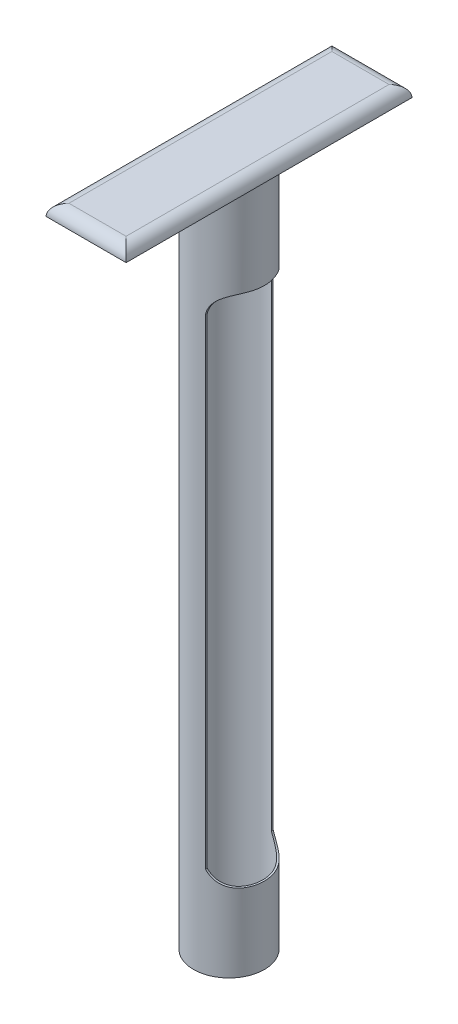
ISO-10303-21;
HEADER;
FILE_DESCRIPTION(('STEP AP214'),'2;1');
FILE_NAME('part.step','',(''),(''),'','','');
FILE_SCHEMA(('AUTOMOTIVE_DESIGN { 1 0 10303 214 1 1 1 1 }'));
ENDSEC;
DATA;
#1=APPLICATION_CONTEXT('core data for automotive mechanical design processes');
#2=APPLICATION_PROTOCOL_DEFINITION('international standard','automotive_design',2000,#1);
#3=PRODUCT_CONTEXT('',#1,'mechanical');
#4=PRODUCT('Part','Part','',(#3));
#5=PRODUCT_RELATED_PRODUCT_CATEGORY('part','',(#4));
#6=PRODUCT_DEFINITION_FORMATION('','',#4);
#7=PRODUCT_DEFINITION_CONTEXT('part definition',#1,'design');
#8=PRODUCT_DEFINITION('design','',#6,#7);
#9=PRODUCT_DEFINITION_SHAPE('','',#8);
#10=(LENGTH_UNIT() NAMED_UNIT(*) SI_UNIT(.MILLI.,.METRE.));
#11=(NAMED_UNIT(*) PLANE_ANGLE_UNIT() SI_UNIT($,.RADIAN.));
#12=(NAMED_UNIT(*) SI_UNIT($,.STERADIAN.) SOLID_ANGLE_UNIT());
#13=UNCERTAINTY_MEASURE_WITH_UNIT(LENGTH_MEASURE(1.E-05),#10,'distance_accuracy_value','');
#14=(GEOMETRIC_REPRESENTATION_CONTEXT(3) GLOBAL_UNCERTAINTY_ASSIGNED_CONTEXT((#13)) GLOBAL_UNIT_ASSIGNED_CONTEXT((#10,
#11,#12)) REPRESENTATION_CONTEXT('',''));
#15=CARTESIAN_POINT('',(0.,0.,0.));
#16=DIRECTION('',(0.,0.,1.));
#17=DIRECTION('',(1.,0.,0.));
#18=AXIS2_PLACEMENT_3D('',#15,#16,#17);
#19=CARTESIAN_POINT('',(0.,300.,0.));
#20=DIRECTION('',(0.,-1.,0.));
#21=DIRECTION('',(0.,0.,-1.));
#22=AXIS2_PLACEMENT_3D('',#19,#20,#21);
#23=CYLINDRICAL_SURFACE('',#22,15.5);
#24=CARTESIAN_POINT('',(0.,300.,0.));
#25=DIRECTION('',(0.,1.,0.));
#26=DIRECTION('',(0.,0.,1.));
#27=AXIS2_PLACEMENT_3D('',#24,#25,#26);
#28=CIRCLE('',#27,15.5);
#29=CARTESIAN_POINT('',(0.,300.,15.5));
#30=VERTEX_POINT('',#29);
#31=EDGE_CURVE('E186',#30,#30,#28,.T.);
#32=ORIENTED_EDGE('',*,*,#31,.F.);
#33=EDGE_LOOP('',(#32));
#34=FACE_BOUND('',#33,.T.);
#35=CARTESIAN_POINT('',(0.,0.,0.));
#36=DIRECTION('',(0.,1.,0.));
#37=DIRECTION('',(0.,0.,1.));
#38=AXIS2_PLACEMENT_3D('',#35,#36,#37);
#39=CIRCLE('',#38,15.5);
#40=CARTESIAN_POINT('',(0.,0.,15.5));
#41=VERTEX_POINT('',#40);
#42=EDGE_CURVE('E188',#41,#41,#39,.T.);
#43=ORIENTED_EDGE('',*,*,#42,.T.);
#44=EDGE_LOOP('',(#43));
#45=FACE_BOUND('',#44,.T.);
#46=DIRECTION('',(0.,-1.,0.));
#47=VECTOR('',#46,1.);
#48=CARTESIAN_POINT('',(4.5,300.,14.8323969741913));
#49=LINE('',#48,#47);
#50=CARTESIAN_POINT('',(4.5,250.,14.8323969741913));
#51=VERTEX_POINT('',#50);
#52=CARTESIAN_POINT('',(4.5,40.,14.8323969741913));
#53=VERTEX_POINT('',#52);
#54=EDGE_CURVE('E112',#51,#53,#49,.T.);
#55=ORIENTED_EDGE('',*,*,#54,.F.);
#56=CARTESIAN_POINT('',(4.5,250.,-14.8323969741913));
#57=CARTESIAN_POINT('',(4.52736125072849,250.14229434374,-14.8240931957483));
#58=CARTESIAN_POINT('',(4.55747183218923,250.283990480796,-14.8148782123871));
#59=CARTESIAN_POINT('',(4.6231286540091,250.565980645494,-14.794521894909));
#60=CARTESIAN_POINT('',(4.65867499363321,250.706274647481,-14.783380525613));
#61=CARTESIAN_POINT('',(4.77336833459055,251.124725610449,-14.7469124273955));
#62=CARTESIAN_POINT('',(4.86057192739907,251.400463310298,-14.7185410397328));
#63=CARTESIAN_POINT('',(5.05573435550025,251.94373009711,-14.65265011217));
#64=CARTESIAN_POINT('',(5.16371886623004,252.211248549801,-14.6151192399114));
#65=CARTESIAN_POINT('',(5.39927838936463,252.735806373789,-14.5297446130908));
#66=CARTESIAN_POINT('',(5.52685192649611,252.992846532376,-14.4819016350366));
#67=CARTESIAN_POINT('',(5.80048307162679,253.495109702987,-14.3744924898614));
#68=CARTESIAN_POINT('',(5.94658116840615,253.740305154203,-14.3149004798074));
#69=CARTESIAN_POINT('',(6.25525893749483,254.216428805808,-14.1827327207283));
#70=CARTESIAN_POINT('',(6.41783894462942,254.447356716203,-14.1101567079141));
#71=CARTESIAN_POINT('',(6.75705446843943,254.892901263545,-13.950887173011));
#72=CARTESIAN_POINT('',(6.93366840227825,255.107541991437,-13.8642151223288));
#73=CARTESIAN_POINT('',(7.29863003911818,255.519429608947,-13.6756047952115));
#74=CARTESIAN_POINT('',(7.48697716879136,255.716677347316,-13.5736672643639));
#75=CARTESIAN_POINT('',(7.86532536289268,256.085610641422,-13.3578547306141));
#76=CARTESIAN_POINT('',(8.05499992182894,256.257977139721,-13.2445702606502));
#77=CARTESIAN_POINT('',(8.43983836703546,256.584929608776,-13.002721215429));
#78=CARTESIAN_POINT('',(8.6350021014688,256.739516070748,-12.8741570625087));
#79=CARTESIAN_POINT('',(9.02807244694339,257.03075137008,-12.6016313943501));
#80=CARTESIAN_POINT('',(9.22598002629205,257.167393687095,-12.4576643164601));
#81=CARTESIAN_POINT('',(9.62169433306973,257.422904206783,-12.1546328385362));
#82=CARTESIAN_POINT('',(9.81950105870868,257.541772104218,-11.9955681793086));
#83=CARTESIAN_POINT('',(10.212066049432,257.762188298184,-11.663179027026));
#84=CARTESIAN_POINT('',(10.4068288680052,257.863765287783,-11.4898788796617));
#85=CARTESIAN_POINT('',(10.7912970292621,258.050836056341,-11.1295697971706));
#86=CARTESIAN_POINT('',(10.9810023972033,258.136329915633,-10.9425609305243));
#87=CARTESIAN_POINT('',(11.3533604615346,258.292519767909,-10.555723552186));
#88=CARTESIAN_POINT('',(11.5360116163899,258.363212541214,-10.3558922635593));
#89=CARTESIAN_POINT('',(11.892512220937,258.49123164141,-9.94445923109315));
#90=CARTESIAN_POINT('',(12.0663611346885,258.548557155175,-9.732856772187));
#91=CARTESIAN_POINT('',(12.4260327712863,258.658149509894,-9.2704045314804));
#92=CARTESIAN_POINT('',(12.6104268981647,258.708761690447,-9.01805130989729));
#93=CARTESIAN_POINT('',(12.9645382070784,258.797143528024,-8.50111419164998));
#94=CARTESIAN_POINT('',(13.1342543478205,258.834912274459,-8.23652942928954));
#95=CARTESIAN_POINT('',(13.457869373775,258.89985599026,-7.6964224631651));
#96=CARTESIAN_POINT('',(13.611759393981,258.927025045753,-7.42089424790992));
#97=CARTESIAN_POINT('',(13.9026919320207,258.972847354263,-6.86038609513071));
#98=CARTESIAN_POINT('',(14.0397324780673,258.991499611305,-6.57540505634818));
#99=CARTESIAN_POINT('',(14.3228499783833,259.02540982441,-5.93731671690391));
#100=CARTESIAN_POINT('',(14.4649058640799,259.039161374514,-5.58233889555439));
#101=CARTESIAN_POINT('',(14.7224495285723,259.060067927401,-4.86267355981491));
#102=CARTESIAN_POINT('',(14.8379343849667,259.067222204846,-4.49798498230903));
#103=CARTESIAN_POINT('',(15.041673511957,259.077425306618,-3.76089096635906));
#104=CARTESIAN_POINT('',(15.1299185767041,259.080472744183,-3.38848296436591));
#105=CARTESIAN_POINT('',(15.2786273943198,259.084399383517,-2.63815224356578));
#106=CARTESIAN_POINT('',(15.3390903101133,259.085278519958,-2.26022935894953));
#107=CARTESIAN_POINT('',(15.4376091871474,259.086290459014,-1.4541985096765));
#108=CARTESIAN_POINT('',(15.4719931586542,259.086318131364,-1.0256367424691));
#109=CARTESIAN_POINT('',(15.5050523056363,259.086350975087,-0.167113989253126));
#110=CARTESIAN_POINT('',(15.5037244124571,259.086356144526,0.262847113823753));
#111=CARTESIAN_POINT('',(15.4653537775787,259.086303381703,1.12142024067485));
#112=CARTESIAN_POINT('',(15.4282908471385,259.086245413767,1.55003136443694));
#113=CARTESIAN_POINT('',(15.3186776084007,259.085006471692,2.40268046340839));
#114=CARTESIAN_POINT('',(15.2461279669604,259.083825518655,2.82671852440054));
#115=CARTESIAN_POINT('',(15.0647005486081,259.078252587464,3.67356729022936));
#116=CARTESIAN_POINT('',(14.9552964782191,259.073812923941,4.09626511547469));
#117=CARTESIAN_POINT('',(14.7012483636246,259.058549800084,4.93087995048933));
#118=CARTESIAN_POINT('',(14.5566009301483,259.047725725634,5.34279591917137));
#119=CARTESIAN_POINT('',(14.2333562807581,259.015679079257,6.15234931206023));
#120=CARTESIAN_POINT('',(14.0547834293927,258.994463952822,6.54999674146009));
#121=CARTESIAN_POINT('',(13.6652960763609,258.936817631956,7.32794230852631));
#122=CARTESIAN_POINT('',(13.4543906614363,258.900390707704,7.70824528183534));
#123=CARTESIAN_POINT('',(13.0545852061196,258.817592545758,8.36297293282717));
#124=CARTESIAN_POINT('',(12.8717572430818,258.775427086115,8.64165328508786));
#125=CARTESIAN_POINT('',(12.4899212638303,258.676130705922,9.18487928139728));
#126=CARTESIAN_POINT('',(12.2909169359938,258.619003190309,9.44942812490511));
#127=CARTESIAN_POINT('',(11.8788813080557,258.487097781503,9.96244589377778));
#128=CARTESIAN_POINT('',(11.6658605534335,258.412333050891,10.2109266353495));
#129=CARTESIAN_POINT('',(11.2282785982419,258.242498721927,10.6902310479751));
#130=CARTESIAN_POINT('',(11.0037172495543,258.14742886292,10.9210544923112));
#131=CARTESIAN_POINT('',(10.5441665679453,257.933629380202,11.3654596313996));
#132=CARTESIAN_POINT('',(10.3090982964644,257.814683074089,11.5788562079738));
#133=CARTESIAN_POINT('',(9.83462147006923,257.551828464821,11.9844744982373));
#134=CARTESIAN_POINT('',(9.59521289927099,257.407920070296,12.1766961344158));
#135=CARTESIAN_POINT('',(9.11687885541271,257.094138130139,12.538837891582));
#136=CARTESIAN_POINT('',(8.87795315091921,256.924284990557,12.7087753459775));
#137=CARTESIAN_POINT('',(8.40536302409366,256.558309279616,13.0261616470522));
#138=CARTESIAN_POINT('',(8.17169775430919,256.362190975446,13.1736141384631));
#139=CARTESIAN_POINT('',(7.74899754867385,255.975878829871,13.4258790915646));
#140=CARTESIAN_POINT('',(7.55853849722778,255.789235842639,13.5337690302035));
#141=CARTESIAN_POINT('',(7.18783418282517,255.398436647652,13.7342432329586));
#142=CARTESIAN_POINT('',(7.00758787904265,255.194282229915,13.8268290586348));
#143=CARTESIAN_POINT('',(6.65979000760485,254.76959314293,13.9976706088854));
#144=CARTESIAN_POINT('',(6.49224621022169,254.549048608394,14.0759176030378));
#145=CARTESIAN_POINT('',(6.17223146825217,254.093225422536,14.2191527298752));
#146=CARTESIAN_POINT('',(6.01976028033083,253.857947009181,14.2841410766282));
#147=CARTESIAN_POINT('',(5.73645421076229,253.382214526183,14.4002003929563));
#148=CARTESIAN_POINT('',(5.60507834304386,253.142175182142,14.451654086422));
#149=CARTESIAN_POINT('',(5.35959400758554,252.651520162136,14.5444829019017));
#150=CARTESIAN_POINT('',(5.24548740799686,252.400903345667,14.5858569338149));
#151=CARTESIAN_POINT('',(5.03584908338158,251.891236158479,14.6595550135236));
#152=CARTESIAN_POINT('',(4.94028742293195,251.632200180776,14.6918936840338));
#153=CARTESIAN_POINT('',(4.76839810914734,251.107082447679,14.7485788874614));
#154=CARTESIAN_POINT('',(4.69206067938549,250.841004349926,14.7729294846049));
#155=CARTESIAN_POINT('',(4.60221468110802,250.477466841299,14.8010205632877));
#156=CARTESIAN_POINT('',(4.58001803628529,250.382326377063,14.8079003907981));
#157=CARTESIAN_POINT('',(4.53813363013137,250.1915480631,14.8207902688407));
#158=CARTESIAN_POINT('',(4.51844309412852,250.095910887643,14.8268012823103));
#159=CARTESIAN_POINT('',(4.50000000000001,250.,14.8323969741913));
#160=B_SPLINE_CURVE_WITH_KNOTS('',3,(#56,#57,#58,#59,#60,#61,#62,#63,#64,#65,#66,#67,#68,#69,
#70,#71,#72,#73,#74,#75,#76,#77,#78,#79,#80,#81,#82,#83,#84,#85,#86,#87,#88,#89,#90,#91,#92,#93,
#94,#95,#96,#97,#98,#99,#100,#101,#102,#103,#104,#105,#106,#107,#108,#109,#110,#111,#112,#113,
#114,#115,#116,#117,#118,#119,#120,#121,#122,#123,#124,#125,#126,#127,#128,#129,#130,#131,#132,
#133,#134,#135,#136,#137,#138,#139,#140,#141,#142,#143,#144,#145,#146,#147,#148,#149,#150,#151,
#152,#153,#154,#155,#156,#157,#158,#159),.UNSPECIFIED.,.F.,.F.,(4,2,2,2,2,2,2,2,2,2,2,2,2,2,2,2,
2,2,2,2,2,2,2,2,2,2,2,2,2,2,2,2,2,2,2,2,2,2,2,2,2,2,2,2,2,2,2,2,2,2,2,4),(0.,0.435353682126536,
0.870715315403884,1.74140264021945,2.61317271285392,3.48487716359958,4.35852083033956,
5.23218224845771,6.10452513942882,6.97682543784028,7.81643549886229,8.65602235810112,
9.49591345796414,10.3358189795911,11.1743168535981,12.012810539257,12.8514864333043,
13.6902133303956,14.6391560588297,15.5881660525126,16.5377047716943,17.48735450383,
18.6339705972134,19.7807127403787,20.9278420086051,22.0750058375241,23.363307459638,
24.6517197834846,25.9408604309951,27.2299768542318,28.5383430341523,29.8468350862464,
31.1543909341836,32.4615799780939,33.4685268766178,34.4752448214937,35.481213820518,
36.487195733908,37.5027572499143,38.5183224832562,39.5330930289231,40.5476989086679,
41.4095997794087,42.2714126514618,43.1337485208462,43.9960704662465,44.8304511339122,
45.6649219986142,46.4980344385606,47.330722342106,47.6245069374893,47.9179633822534),.UNSPECIFIED.);
#161=CARTESIAN_POINT('',(4.5,250.,-14.8323969741913));
#162=VERTEX_POINT('',#161);
#163=EDGE_CURVE('E101',#162,#51,#160,.T.);
#164=ORIENTED_EDGE('',*,*,#163,.F.);
#165=DIRECTION('',(0.,-1.,0.));
#166=VECTOR('',#165,1.);
#167=CARTESIAN_POINT('',(4.5,300.,-14.8323969741913));
#168=LINE('',#167,#166);
#169=CARTESIAN_POINT('',(4.5,40.,-14.8323969741913));
#170=VERTEX_POINT('',#169);
#171=EDGE_CURVE('E120',#170,#162,#168,.F.);
#172=ORIENTED_EDGE('',*,*,#171,.F.);
#173=CARTESIAN_POINT('',(4.5,40.,14.8323969741913));
#174=CARTESIAN_POINT('',(4.57499971992733,39.8663702307356,14.8096410996568));
#175=CARTESIAN_POINT('',(4.65233297737036,39.734294031528,14.7855594564231));
#176=CARTESIAN_POINT('',(4.81149246936355,39.4734345845962,14.7345355284673));
#177=CARTESIAN_POINT('',(4.89331891033786,39.3446514885616,14.7075931122635));
#178=CARTESIAN_POINT('',(5.14528068018568,38.9635168626263,14.6221594026025));
#179=CARTESIAN_POINT('',(5.32188542466923,38.7164031703212,14.559065511349));
#180=CARTESIAN_POINT('',(5.69022214841346,38.2381254530891,14.4190898272626));
#181=CARTESIAN_POINT('',(5.88194514517225,38.0069521080065,14.3422161876002));
#182=CARTESIAN_POINT('',(6.27829182309782,37.5619267171132,14.173194329727));
#183=CARTESIAN_POINT('',(6.48291359470988,37.3480721180681,14.0810483691789));
#184=CARTESIAN_POINT('',(6.90305243587393,36.9383082740827,13.8799228914371));
#185=CARTESIAN_POINT('',(7.11860174470257,36.7424575774701,13.7708913483825));
#186=CARTESIAN_POINT('',(7.55697994127647,36.3704100675681,13.5352856483961));
#187=CARTESIAN_POINT('',(7.77980916046449,36.1942141507463,13.4087106918876));
#188=CARTESIAN_POINT('',(8.22919232033086,35.8622234783211,13.1376990793951));
#189=CARTESIAN_POINT('',(8.45574093001319,35.7064019795626,12.9932863315062));
#190=CARTESIAN_POINT('',(8.90954611833601,35.4149010355262,12.6864100400565));
#191=CARTESIAN_POINT('',(9.13680267586752,35.2792209954468,12.5239470297896));
#192=CARTESIAN_POINT('',(9.58140501312032,35.0316248616079,12.1869571752213));
#193=CARTESIAN_POINT('',(9.79883147321203,34.9190755738662,12.0130003604426));
#194=CARTESIAN_POINT('',(10.2286547103282,34.7114678079505,11.6492015060076));
#195=CARTESIAN_POINT('',(10.4410515809643,34.6164090040168,11.4593597623033));
#196=CARTESIAN_POINT('',(10.858596950997,34.4424863473723,11.0645158475182));
#197=CARTESIAN_POINT('',(11.0637390145257,34.3636365896837,10.8595006908733));
#198=CARTESIAN_POINT('',(11.4645209648464,34.220754680165,10.435510516075));
#199=CARTESIAN_POINT('',(11.660160328413,34.1567233435185,10.2165347307712));
#200=CARTESIAN_POINT('',(12.0563573580966,34.0369629925676,9.74661667399935));
#201=CARTESIAN_POINT('',(12.2559207505021,33.9824015132171,9.49453913536969));
#202=CARTESIAN_POINT('',(12.6400469460849,33.8866142760854,8.9768114501491));
#203=CARTESIAN_POINT('',(12.8246090776381,33.8453891151408,8.71116069673565));
#204=CARTESIAN_POINT('',(13.1773863222937,33.7740854998407,8.16770879236222));
#205=CARTESIAN_POINT('',(13.345597330908,33.7440098389491,7.88990461587489));
#206=CARTESIAN_POINT('',(13.664555150075,33.6929236159217,7.32363090224204));
#207=CARTESIAN_POINT('',(13.8153000117245,33.6719140646871,7.03516017963274));
#208=CARTESIAN_POINT('',(14.1236528490323,33.6339047867046,6.39682594473101));
#209=CARTESIAN_POINT('',(14.2777178592182,33.6182816266151,6.04516419444175));
#210=CARTESIAN_POINT('',(14.5593973607223,33.5940430394251,5.33116147775111));
#211=CARTESIAN_POINT('',(14.6870093245473,33.5854282817224,4.96881949466638));
#212=CARTESIAN_POINT('',(14.9150457646243,33.5727716928301,4.23543683139683));
#213=CARTESIAN_POINT('',(15.0154588476818,33.5687317757244,3.86439257645848));
#214=CARTESIAN_POINT('',(15.1884507653012,33.563270722494,3.11585413065716));
#215=CARTESIAN_POINT('',(15.2610286942541,33.5618496715676,2.73835973035781));
#216=CARTESIAN_POINT('',(15.3847268780698,33.5600752534858,1.93493086361218));
#217=CARTESIAN_POINT('',(15.4323803600548,33.5598648984999,1.50845801209329));
#218=CARTESIAN_POINT('',(15.4921740046185,33.5596867776258,0.653008469357032));
#219=CARTESIAN_POINT('',(15.50431138089,33.55971903077,0.224031584338534));
#220=CARTESIAN_POINT('',(15.4929827393328,33.5597199795276,-0.633613374844401));
#221=CARTESIAN_POINT('',(15.4695036249342,33.5596886517601,-1.06228127739758));
#222=CARTESIAN_POINT('',(15.3870797758726,33.560157860815,-1.91618490991139));
#223=CARTESIAN_POINT('',(15.328135555255,33.5606583899286,-2.34142068952807));
#224=CARTESIAN_POINT('',(15.1739224969906,33.5636949739883,-3.192520459963));
#225=CARTESIAN_POINT('',(15.0780692008418,33.5662645463744,-3.61827859698273));
#226=CARTESIAN_POINT('',(14.8508185990671,33.5759225748283,-4.46019124947178));
#227=CARTESIAN_POINT('',(14.719418738652,33.5830113557486,-4.87634507232933));
#228=CARTESIAN_POINT('',(14.4221309075914,33.6049723297581,-5.69579209264437));
#229=CARTESIAN_POINT('',(14.2562544776685,33.6198419208122,-6.09908954168651));
#230=CARTESIAN_POINT('',(13.8913859900415,33.6613622784579,-6.88976476249493));
#231=CARTESIAN_POINT('',(13.6924000883636,33.6880108565118,-7.27714547698668));
#232=CARTESIAN_POINT('',(13.3005845961656,33.7516493092202,-7.96701583970286));
#233=CARTESIAN_POINT('',(13.112694427699,33.7860373019884,-8.27255916325901));
#234=CARTESIAN_POINT('',(12.7171519378138,33.8688561839813,-8.86859122831259));
#235=CARTESIAN_POINT('',(12.5095018106913,33.9172855151687,-9.15908163587955));
#236=CARTESIAN_POINT('',(12.0765599965765,34.0310990998277,-9.72280293367331));
#237=CARTESIAN_POINT('',(11.8512812932332,34.0964709554707,-9.99604626352941));
#238=CARTESIAN_POINT('',(11.385514989403,34.2471069230238,-10.5234882954936));
#239=CARTESIAN_POINT('',(11.1450272896739,34.3323711647461,-10.7776868733066));
#240=CARTESIAN_POINT('',(10.6499780004061,34.526324829536,-11.2672162306556));
#241=CARTESIAN_POINT('',(10.3953131311621,34.6352094709127,-11.5023658747417));
#242=CARTESIAN_POINT('',(9.87790074355069,34.8782767515073,-11.9496446828126));
#243=CARTESIAN_POINT('',(9.61515317724338,35.0124595407976,-12.1617737102241));
#244=CARTESIAN_POINT('',(9.08648275742723,35.3076320027117,-12.5616729223833));
#245=CARTESIAN_POINT('',(8.82056206785645,35.4686042786521,-12.7494587753429));
#246=CARTESIAN_POINT('',(8.29056270940755,35.8181252259395,-13.1002880105785));
#247=CARTESIAN_POINT('',(8.02648372747794,36.0066690847866,-13.2633357006943));
#248=CARTESIAN_POINT('',(7.54273990027367,36.3821049520448,-13.5434004455355));
#249=CARTESIAN_POINT('',(7.32212751905999,36.5653717067079,-13.6636656485956));
#250=CARTESIAN_POINT('',(6.88927067301515,36.9512827797709,-13.886945259838));
#251=CARTESIAN_POINT('',(6.67702614767405,37.1539269580117,-13.9899597927815));
#252=CARTESIAN_POINT('',(6.26392116949024,37.5774143806101,-14.179738155863));
#253=CARTESIAN_POINT('',(6.06305677787186,37.7982512625454,-14.2665076328337));
#254=CARTESIAN_POINT('',(5.67526217239941,38.2567149442653,-14.4251613364876));
#255=CARTESIAN_POINT('',(5.48832709645094,38.4943358285634,-14.4970507728451));
#256=CARTESIAN_POINT('',(5.16295686940287,38.9403372656698,-14.615683987568));
#257=CARTESIAN_POINT('',(5.0218711283044,39.1462146255468,-14.6646237875654));
#258=CARTESIAN_POINT('',(4.75177393779282,39.5666954015851,-14.7543473475244));
#259=CARTESIAN_POINT('',(4.62273295160238,39.7812755159437,-14.7951513537572));
#260=CARTESIAN_POINT('',(4.5,40.,-14.8323969741913));
#261=B_SPLINE_CURVE_WITH_KNOTS('',3,(#173,#174,#175,#176,#177,#178,#179,#180,#181,#182,#183,
#184,#185,#186,#187,#188,#189,#190,#191,#192,#193,#194,#195,#196,#197,#198,#199,#200,#201,#202,
#203,#204,#205,#206,#207,#208,#209,#210,#211,#212,#213,#214,#215,#216,#217,#218,#219,#220,#221,
#222,#223,#224,#225,#226,#227,#228,#229,#230,#231,#232,#233,#234,#235,#236,#237,#238,#239,#240,
#241,#242,#243,#244,#245,#246,#247,#248,#249,#250,#251,#252,#253,#254,#255,#256,#257,#258,#259,
#260),.UNSPECIFIED.,.F.,.F.,(4,2,2,2,2,2,2,2,2,2,2,2,2,2,2,2,2,2,2,2,2,2,2,2,2,2,2,2,2,2,2,2,2,
2,2,2,2,2,2,2,2,2,2,4),(0.,0.464691441852762,0.929404250277359,1.85891022763701,
2.78786804150425,3.71668865252054,4.64843016110825,5.58021414968491,6.51076254517663,
7.44128345498294,8.34130164666435,9.24130307384348,10.1420838419994,11.04291415169,
12.0202779972261,12.997685576413,13.9753378760231,14.9530991589524,16.1046594070261,
17.256329631866,18.4084815303028,19.5606709105039,20.8465465722558,22.1325231107353,
23.418972631367,24.705403506133,26.0131035198852,27.3208975451433,28.6282545010949,
29.9353686519352,31.0153326430481,32.0951768463952,33.1742330852052,34.2532963658306,
35.341642927011,36.4299959446238,37.5176449406439,38.6051043183604,39.5369335841482,
40.468756110423,41.4002541284227,42.3314254644843,43.0938746133295,43.8544020203943),.UNSPECIFIED.);
#262=EDGE_CURVE('E111',#53,#170,#261,.T.);
#263=ORIENTED_EDGE('',*,*,#262,.F.);
#264=EDGE_LOOP('',(#55,#164,#172,#263));
#265=FACE_BOUND('',#264,.T.);
#266=ADVANCED_FACE('F33',(#34,#45,#265),#23,.T.);
#267=CARTESIAN_POINT('',(0.,300.,0.));
#268=DIRECTION('',(0.,-1.,0.));
#269=DIRECTION('',(0.,0.,-1.));
#270=AXIS2_PLACEMENT_3D('',#267,#268,#269);
#271=CYLINDRICAL_SURFACE('',#270,14.75);
#272=CARTESIAN_POINT('',(0.,300.,0.));
#273=DIRECTION('',(0.,1.,0.));
#274=DIRECTION('',(0.,0.,1.));
#275=AXIS2_PLACEMENT_3D('',#272,#273,#274);
#276=CIRCLE('',#275,14.75);
#277=CARTESIAN_POINT('',(0.,300.,14.75));
#278=VERTEX_POINT('',#277);
#279=EDGE_CURVE('E192',#278,#278,#276,.T.);
#280=ORIENTED_EDGE('',*,*,#279,.T.);
#281=EDGE_LOOP('',(#280));
#282=FACE_BOUND('',#281,.T.);
#283=CARTESIAN_POINT('',(0.,0.,0.));
#284=DIRECTION('',(0.,1.,0.));
#285=DIRECTION('',(0.,0.,1.));
#286=AXIS2_PLACEMENT_3D('',#283,#284,#285);
#287=CIRCLE('',#286,14.75);
#288=CARTESIAN_POINT('',(0.,0.,14.75));
#289=VERTEX_POINT('',#288);
#290=EDGE_CURVE('E189',#289,#289,#287,.T.);
#291=ORIENTED_EDGE('',*,*,#290,.F.);
#292=EDGE_LOOP('',(#291));
#293=FACE_BOUND('',#292,.T.);
#294=CARTESIAN_POINT('',(4.5,250.,-14.0467967878801));
#295=CARTESIAN_POINT('',(4.52710628983874,250.140968618449,-14.0381103475507));
#296=CARTESIAN_POINT('',(4.55690989711659,250.281344303767,-14.0284790501659));
#297=CARTESIAN_POINT('',(4.62184816482426,250.560707316762,-14.0072196292234));
#298=CARTESIAN_POINT('',(4.65698293315188,250.699694616279,-13.9955914652504));
#299=CARTESIAN_POINT('',(4.770285354219,251.11425639737,-13.957552063004));
#300=CARTESIAN_POINT('',(4.85635215945197,251.387436141623,-13.9279855919799));
#301=CARTESIAN_POINT('',(5.04883326943222,251.925730741489,-13.8593730733926));
#302=CARTESIAN_POINT('',(5.15527694287843,252.190833308476,-13.820313321209));
#303=CARTESIAN_POINT('',(5.38732143198407,252.710659946197,-13.7315218179923));
#304=CARTESIAN_POINT('',(5.51292069542535,252.965384855736,-13.681790931531));
#305=CARTESIAN_POINT('',(5.78216402769078,253.463165229944,-13.570200943559));
#306=CARTESIAN_POINT('',(5.92585049690005,253.706191356469,-13.5083131459968));
#307=CARTESIAN_POINT('',(6.22921489684845,254.178089088336,-13.3711285386111));
#308=CARTESIAN_POINT('',(6.38889317000102,254.406960390428,-13.2958314416434));
#309=CARTESIAN_POINT('',(6.72174922761676,254.84848623767,-13.1306903890704));
#310=CARTESIAN_POINT('',(6.89490473143994,255.061166444895,-13.0408701889366));
#311=CARTESIAN_POINT('',(7.25234088609732,255.46925896792,-12.8455247214032));
#312=CARTESIAN_POINT('',(7.43662094488636,255.664672201302,-12.7400002893404));
#313=CARTESIAN_POINT('',(7.80568277692308,256.029516735607,-12.5171226443888));
#314=CARTESIAN_POINT('',(7.99013657331523,256.199683288398,-12.40042868815));
#315=CARTESIAN_POINT('',(8.36381208962994,256.522517934301,-12.1515236402493));
#316=CARTESIAN_POINT('',(8.55303366911781,256.67518654208,-12.0193130052115));
#317=CARTESIAN_POINT('',(8.93347158636947,256.962906844159,-11.739309302322));
#318=CARTESIAN_POINT('',(9.12468867302716,257.097951647342,-11.5915101797875));
#319=CARTESIAN_POINT('',(9.50625185424862,257.350621606464,-11.2807012365041));
#320=CARTESIAN_POINT('',(9.69659793442352,257.46824647563,-11.1176911654179));
#321=CARTESIAN_POINT('',(10.0727638102173,257.68615446721,-10.7780238973171));
#322=CARTESIAN_POINT('',(10.2586026612047,257.786528876457,-10.6014461764754));
#323=CARTESIAN_POINT('',(10.6245091536661,257.971727243717,-10.2347156804448));
#324=CARTESIAN_POINT('',(10.8045768408208,258.056551324842,-10.0445630127448));
#325=CARTESIAN_POINT('',(11.1569819495757,258.211937172478,-9.65162787537939));
#326=CARTESIAN_POINT('',(11.3293176352899,258.282495748632,-9.44884259377404));
#327=CARTESIAN_POINT('',(11.6645476036427,258.410767796985,-9.03174617867425));
#328=CARTESIAN_POINT('',(11.8274413019866,258.468480474874,-8.81743433346491));
#329=CARTESIAN_POINT('',(12.1624295703261,258.579194168307,-8.35047960599943));
#330=CARTESIAN_POINT('',(12.3330639233825,258.630665103011,-8.09642602638823));
#331=CARTESIAN_POINT('',(12.6590472834338,258.721409861884,-7.57662018137121));
#332=CARTESIAN_POINT('',(12.8143952510402,258.760682857052,-7.31086712224198));
#333=CARTESIAN_POINT('',(13.1087049853007,258.829161528167,-6.76900767006403));
#334=CARTESIAN_POINT('',(13.2476575598765,258.858361574194,-6.49289558247435));
#335=CARTESIAN_POINT('',(13.5081827866942,258.908626954985,-5.93187835317856));
#336=CARTESIAN_POINT('',(13.6297543788036,258.929691793686,-5.64697267640558));
#337=CARTESIAN_POINT('',(13.8762587529259,258.968860836728,-5.01476767203682));
#338=CARTESIAN_POINT('',(13.9974279702424,258.985638636277,-4.66591307050066));
#339=CARTESIAN_POINT('',(14.2133160648621,259.012728011736,-3.959857677315));
#340=CARTESIAN_POINT('',(14.3080322107674,259.023038920047,-3.60265602791893));
#341=CARTESIAN_POINT('',(14.4704308435659,259.039223443985,-2.88194605992733));
#342=CARTESIAN_POINT('',(14.5381050524237,259.045095701349,-2.51843584564206));
#343=CARTESIAN_POINT('',(14.6459727103902,259.053867290696,-1.78732832985604));
#344=CARTESIAN_POINT('',(14.6861654602248,259.05676654703,-1.41973092459733));
#345=CARTESIAN_POINT('',(14.7415800470107,259.060675827516,-0.644070032385993));
#346=CARTESIAN_POINT('',(14.7537603039648,259.061457274391,-0.235784704655866));
#347=CARTESIAN_POINT('',(14.7442266316102,259.06081559042,0.580410229170058));
#348=CARTESIAN_POINT('',(14.7225100260336,259.059392285502,0.988319803054554));
#349=CARTESIAN_POINT('',(14.6453055777598,259.053752660268,1.80119749003009));
#350=CARTESIAN_POINT('',(14.5897946988003,259.049534434587,2.20616340582559));
#351=CARTESIAN_POINT('',(14.4453801946279,259.03681905449,3.01002475298781));
#352=CARTESIAN_POINT('',(14.3564772203419,259.028321983483,3.40892030252917));
#353=CARTESIAN_POINT('',(14.1445915733774,259.004551888618,4.20285377970366));
#354=CARTESIAN_POINT('',(14.0211866593029,258.989193403647,4.59777671485025));
#355=CARTESIAN_POINT('',(13.7418156537639,258.948398288243,5.3754726333198));
#356=CARTESIAN_POINT('',(13.58584628586,258.922960643474,5.75824438959645));
#357=CARTESIAN_POINT('',(13.2430542952812,258.857998340206,6.50797319519553));
#358=CARTESIAN_POINT('',(13.0562673441395,258.818489908171,6.87494791756948));
#359=CARTESIAN_POINT('',(12.653895880985,258.720712714036,7.59009639788253));
#360=CARTESIAN_POINT('',(12.4383211878399,258.662450338979,7.93827650964247));
#361=CARTESIAN_POINT('',(12.0389104062543,258.539719687023,8.5276128001616));
#362=CARTESIAN_POINT('',(11.8606963368249,258.480482918233,8.77369009848436));
#363=CARTESIAN_POINT('',(11.491683833206,258.346462921393,9.25174583040051));
#364=CARTESIAN_POINT('',(11.3008883550444,258.271683336337,9.48372755134097));
#365=CARTESIAN_POINT('',(10.9090788265583,258.104546242234,9.93191969114211));
#366=CARTESIAN_POINT('',(10.708072667452,258.012202160686,10.1481419840606));
#367=CARTESIAN_POINT('',(10.2984591370412,257.80804370019,10.5635846833861));
#368=CARTESIAN_POINT('',(10.0898516432197,257.696229007307,10.7628048155821));
#369=CARTESIAN_POINT('',(9.66679405239826,257.450799302506,11.1443847553731));
#370=CARTESIAN_POINT('',(9.45231289257258,257.317034467987,11.3266141522421));
#371=CARTESIAN_POINT('',(9.02270883280677,257.027349063998,11.6717243149735));
#372=CARTESIAN_POINT('',(8.80758593033807,256.871428407118,11.834605004496));
#373=CARTESIAN_POINT('',(8.38082253268483,256.537262081378,12.1405616164789));
#374=CARTESIAN_POINT('',(8.16918042694741,256.359027085992,12.2836469391078));
#375=CARTESIAN_POINT('',(7.75333397130141,255.980633237526,12.550272108487));
#376=CARTESIAN_POINT('',(7.54912892401062,255.78047644717,12.6738137915202));
#377=CARTESIAN_POINT('',(7.17454592187314,255.383267410603,12.8891293796232));
#378=CARTESIAN_POINT('',(7.00295853572395,255.188438980128,12.9829172309322));
#379=CARTESIAN_POINT('',(6.67107670525265,254.78356182378,13.1565311226752));
#380=CARTESIAN_POINT('',(6.51078145694058,254.573514183664,13.2363581577077));
#381=CARTESIAN_POINT('',(6.20346495930507,254.139359677976,13.3831448077104));
#382=CARTESIAN_POINT('',(6.05645631664844,253.91523979494,13.450092268785));
#383=CARTESIAN_POINT('',(5.77768431684628,253.454654505445,13.5721784624228));
#384=CARTESIAN_POINT('',(5.64592080841158,253.218189221533,13.6273173121767));
#385=CARTESIAN_POINT('',(5.40391341808939,252.743949894605,13.7250352264929));
#386=CARTESIAN_POINT('',(5.29303244743224,252.506583468264,13.768018961321));
#387=CARTESIAN_POINT('',(5.08775980514287,252.023438427859,13.8451871585716));
#388=CARTESIAN_POINT('',(4.99336843842839,251.777659658339,13.8793714582846));
#389=CARTESIAN_POINT('',(4.82203690678366,251.279568751528,13.9398272662798));
#390=CARTESIAN_POINT('',(4.74507097457004,251.02726688384,13.9661104771514));
#391=CARTESIAN_POINT('',(4.60899982802893,250.517294750832,14.0115834877546));
#392=CARTESIAN_POINT('',(4.54989256000356,250.259625106438,14.0307741031721));
#393=CARTESIAN_POINT('',(4.5,250.,14.0467967878801));
#394=B_SPLINE_CURVE_WITH_KNOTS('',3,(#294,#295,#296,#297,#298,#299,#300,#301,#302,#303,#304,
#305,#306,#307,#308,#309,#310,#311,#312,#313,#314,#315,#316,#317,#318,#319,#320,#321,#322,#323,
#324,#325,#326,#327,#328,#329,#330,#331,#332,#333,#334,#335,#336,#337,#338,#339,#340,#341,#342,
#343,#344,#345,#346,#347,#348,#349,#350,#351,#352,#353,#354,#355,#356,#357,#358,#359,#360,#361,
#362,#363,#364,#365,#366,#367,#368,#369,#370,#371,#372,#373,#374,#375,#376,#377,#378,#379,#380,
#381,#382,#383,#384,#385,#386,#387,#388,#389,#390,#391,#392,#393),.UNSPECIFIED.,.F.,.F.,(4,2,2,
2,2,2,2,2,2,2,2,2,2,2,2,2,2,2,2,2,2,2,2,2,2,2,2,2,2,2,2,2,2,2,2,2,2,2,2,2,2,2,2,2,2,2,2,2,2,4),
(0.,0.431379233941933,0.862767199767868,1.72552671543716,2.58953919766294,3.45348170428417,
4.31948857468509,5.18551399182433,6.05013691908145,6.91471387188746,7.74397454900453,
8.57321082879744,9.40277038448836,10.2323435952304,11.0573817832241,11.882413439136,
12.7076294026598,13.5328963782886,14.4630085510976,15.3931839226942,16.323878343855,
17.254629507413,18.362515513601,19.4705158717196,20.5788551498069,21.687222628876,
22.911188760626,24.1352515333791,25.3601496385972,26.5850238675702,27.8255990998686,
29.0662992115786,30.3055731533456,31.5444254804269,32.472212715387,33.39978273621,
34.3266464886673,35.2535251867719,36.1870157703565,37.1205100368812,38.0535594848633,
38.986521213178,39.813642231925,40.6407043007626,41.4685430446156,42.2963735724849,
43.0920483942077,43.8877379276048,44.6822430629471,45.4766567975509),.UNSPECIFIED.);
#395=CARTESIAN_POINT('',(4.5,250.,-14.0467967878801));
#396=VERTEX_POINT('',#395);
#397=CARTESIAN_POINT('',(4.5,250.,14.0467967878802));
#398=VERTEX_POINT('',#397);
#399=EDGE_CURVE('E147',#396,#398,#394,.T.);
#400=ORIENTED_EDGE('',*,*,#399,.T.);
#401=DIRECTION('',(0.,-1.,0.));
#402=VECTOR('',#401,1.);
#403=CARTESIAN_POINT('',(4.5,300.,14.0467967878801));
#404=LINE('',#403,#402);
#405=CARTESIAN_POINT('',(4.5,40.,14.0467967878802));
#406=VERTEX_POINT('',#405);
#407=EDGE_CURVE('E119',#398,#406,#404,.T.);
#408=ORIENTED_EDGE('',*,*,#407,.T.);
#409=CARTESIAN_POINT('',(4.5,40.,14.0467967878801));
#410=CARTESIAN_POINT('',(4.5738284036375,39.8684570290031,14.023143540613));
#411=CARTESIAN_POINT('',(4.64990728815824,39.7384390867868,13.9981310259864));
#412=CARTESIAN_POINT('',(4.80639076870353,39.481634720479,13.9451763491809));
#413=CARTESIAN_POINT('',(4.8867955800228,39.3548484576869,13.9172340411249));
#414=CARTESIAN_POINT('',(5.1342441267639,38.9795992689501,13.8286924683012));
#415=CARTESIAN_POINT('',(5.30750442731107,38.7362771462914,13.7633840503429));
#416=CARTESIAN_POINT('',(5.66849470442528,38.2652519998741,13.6186802085802));
#417=CARTESIAN_POINT('',(5.85621818648142,38.0375420514775,13.5392910869273));
#418=CARTESIAN_POINT('',(6.24386119631795,37.5991282198562,13.3649479662236));
#419=CARTESIAN_POINT('',(6.44377879365949,37.3884216570473,13.26999642685));
#420=CARTESIAN_POINT('',(6.85380573575731,36.9845753177814,13.0629533916393));
#421=CARTESIAN_POINT('',(7.06394705214269,36.7914969109412,12.9508054067041));
#422=CARTESIAN_POINT('',(7.49074442311346,36.4246260282671,12.7087143873494));
#423=CARTESIAN_POINT('',(7.70740079484551,36.2508344932375,12.5787704855439));
#424=CARTESIAN_POINT('',(8.14363231896635,35.92326462871,12.3008346036551));
#425=CARTESIAN_POINT('',(8.36320293122418,35.7694584597638,12.1528682979592));
#426=CARTESIAN_POINT('',(8.80223374221272,35.4815548527279,11.8387507348967));
#427=CARTESIAN_POINT('',(9.02169394430815,35.3474567725876,11.6726000702486));
#428=CARTESIAN_POINT('',(9.44933239893346,35.1029785696612,11.3289496375072));
#429=CARTESIAN_POINT('',(9.65763006646574,34.9919113927099,11.1520854674116));
#430=CARTESIAN_POINT('',(10.0684746324855,34.7866823963062,10.7826083623759));
#431=CARTESIAN_POINT('',(10.2710216508199,34.6925202243254,10.5899957559679));
#432=CARTESIAN_POINT('',(10.6681797429977,34.5198047333511,10.189798397581));
#433=CARTESIAN_POINT('',(10.8627835114041,34.441265536741,9.98220032840741));
#434=CARTESIAN_POINT('',(11.2418378283957,34.2984386624874,9.55329852435089));
#435=CARTESIAN_POINT('',(11.4262878211145,34.2341517645009,9.33199404051978));
#436=CARTESIAN_POINT('',(11.7975560730022,34.1136142319252,8.85876194078194));
#437=CARTESIAN_POINT('',(11.9833940062263,34.0584107075343,8.60579896728023));
#438=CARTESIAN_POINT('',(12.3395439638956,33.9606633564545,8.08685476134574));
#439=CARTESIAN_POINT('',(12.5098553484002,33.9181200514043,7.82087299302546));
#440=CARTESIAN_POINT('',(12.8336479286983,33.8436239693979,7.2773666940989));
#441=CARTESIAN_POINT('',(12.9871253650415,33.8116735548951,6.99983960413727));
#442=CARTESIAN_POINT('',(13.2761793261856,33.7564199894954,6.4347734048623));
#443=CARTESIAN_POINT('',(13.4117540037755,33.7331177304688,6.1472332662622));
#444=CARTESIAN_POINT('',(13.6847591342542,33.6901282974251,5.51602746137181));
#445=CARTESIAN_POINT('',(13.8188936100198,33.6716485426474,5.17084977787914));
#446=CARTESIAN_POINT('',(14.0608949259947,33.6414863850361,4.47111014702964));
#447=CARTESIAN_POINT('',(14.1687594235412,33.6298045882913,4.11654736586684));
#448=CARTESIAN_POINT('',(14.3575554527603,33.6112021437024,3.40005822389395));
#449=CARTESIAN_POINT('',(14.4384768052997,33.6042832942506,3.03812913476159));
#450=CARTESIAN_POINT('',(14.5728396921822,33.5936592303089,2.30916130844347));
#451=CARTESIAN_POINT('',(14.6262804568496,33.589954105827,1.94212242843844));
#452=CARTESIAN_POINT('',(14.7093022409223,33.5844485214399,1.16833476093597));
#453=CARTESIAN_POINT('',(14.7359790260818,33.582874342539,0.761269689770637));
#454=CARTESIAN_POINT('',(14.7555339121893,33.5817037590934,-0.0536931109842079));
#455=CARTESIAN_POINT('',(14.7484095887051,33.5821074964178,-0.461590898203941));
#456=CARTESIAN_POINT('',(14.7003975120396,33.5850650565807,-1.27557932133293));
#457=CARTESIAN_POINT('',(14.6594942161546,33.5876198692032,-1.68166903879871));
#458=CARTESIAN_POINT('',(14.5441919236851,33.5958511725471,-2.48902824651465));
#459=CARTESIAN_POINT('',(14.4697933935901,33.6015276197936,-2.89029780381545));
#460=CARTESIAN_POINT('',(14.2866577185397,33.6178685310263,-3.69123372451028));
#461=CARTESIAN_POINT('',(14.1774176502895,33.6286072259823,-4.09078379800455));
#462=CARTESIAN_POINT('',(13.9258120659986,33.6576904042066,-4.87908127969113));
#463=CARTESIAN_POINT('',(13.7834440667423,33.6760354577158,-5.26782787562589));
#464=CARTESIAN_POINT('',(13.4669108998117,33.7236118391828,-6.03120545748996));
#465=CARTESIAN_POINT('',(13.29276530636,33.7528364770451,-6.40584496260621));
#466=CARTESIAN_POINT('',(12.9143477876124,33.8260643166031,-7.13805489409242));
#467=CARTESIAN_POINT('',(12.7100826737861,33.8700641797771,-7.49562915559549));
#468=CARTESIAN_POINT('',(12.3160346217233,33.9668255698515,-8.12326018785025));
#469=CARTESIAN_POINT('',(12.1310822295934,34.0162503734608,-8.39687524840118));
#470=CARTESIAN_POINT('',(11.7448593514229,34.129941528701,-8.92909986510513));
#471=CARTESIAN_POINT('',(11.5435909203163,34.1942060132174,-9.18771130388192));
#472=CARTESIAN_POINT('',(11.1270849811619,34.3398932757411,-9.68794641362118));
#473=CARTESIAN_POINT('',(10.9118602027375,34.4213005659476,-9.92958515767407));
#474=CARTESIAN_POINT('',(10.4699891788672,34.6035261594945,-10.3944527536851));
#475=CARTESIAN_POINT('',(10.2433428433504,34.7043446159299,-10.6176814604243));
#476=CARTESIAN_POINT('',(9.78040899789379,34.9280027984307,-11.0456369885541));
#477=CARTESIAN_POINT('',(9.54406847054169,35.0509811730403,-11.2502343540683));
#478=CARTESIAN_POINT('',(9.06700001052586,35.3199203596852,-11.638149817747));
#479=CARTESIAN_POINT('',(8.82627204440517,35.4658813470421,-11.8214677535641));
#480=CARTESIAN_POINT('',(8.34465916125919,35.7815298456632,-12.1662191197589));
#481=CARTESIAN_POINT('',(8.10377423640934,35.951218647005,-12.3276513592741));
#482=CARTESIAN_POINT('',(7.62626977541008,36.3143047296065,-12.6286247133295));
#483=CARTESIAN_POINT('',(7.38964973125268,36.5076991654929,-12.7681684505588));
#484=CARTESIAN_POINT('',(6.95050416929609,36.8949197623287,-13.0118786014393));
#485=CARTESIAN_POINT('',(6.74708994441717,37.0863617410507,-13.1182476725742));
#486=CARTESIAN_POINT('',(6.34978383132911,37.4865375259291,-13.3151005319994));
#487=CARTESIAN_POINT('',(6.15589239486627,37.6952721511621,-13.4055835672039));
#488=CARTESIAN_POINT('',(5.78034880664281,38.1285474869956,-13.5717429492743));
#489=CARTESIAN_POINT('',(5.59868368828766,38.3530709188691,-13.6474351500845));
#490=CARTESIAN_POINT('',(5.2495455141072,38.8166281783391,-13.7854998584953));
#491=CARTESIAN_POINT('',(5.08206608956733,39.0556554107872,-13.8478783626476));
#492=CARTESIAN_POINT('',(4.84856030197862,39.4150245711684,-13.9305464850802));
#493=CARTESIAN_POINT('',(4.77627467461318,39.5303042514223,-13.9554735699198));
#494=CARTESIAN_POINT('',(4.63538354300507,39.7633096035658,-14.0029006610233));
#495=CARTESIAN_POINT('',(4.56677210117633,39.8810308745972,-14.0254046464756));
#496=CARTESIAN_POINT('',(4.5,40.,-14.0467967878801));
#497=B_SPLINE_CURVE_WITH_KNOTS('',3,(#409,#410,#411,#412,#413,#414,#415,#416,#417,#418,#419,
#420,#421,#422,#423,#424,#425,#426,#427,#428,#429,#430,#431,#432,#433,#434,#435,#436,#437,#438,
#439,#440,#441,#442,#443,#444,#445,#446,#447,#448,#449,#450,#451,#452,#453,#454,#455,#456,#457,
#458,#459,#460,#461,#462,#463,#464,#465,#466,#467,#468,#469,#470,#471,#472,#473,#474,#475,#476,
#477,#478,#479,#480,#481,#482,#483,#484,#485,#486,#487,#488,#489,#490,#491,#492,#493,#494,#495,
#496),.UNSPECIFIED.,.F.,.F.,(4,2,2,2,2,2,2,2,2,2,2,2,2,2,2,2,2,2,2,2,2,2,2,2,2,2,2,2,2,2,2,2,2,
2,2,2,2,2,2,2,2,2,2,4),(0.,0.45800240028255,0.916027615763507,1.83218638074022,2.74793612724941,
3.66354127666168,4.58222123974952,5.50094599592257,6.4183769339795,7.33577797731325,
8.21969382400053,9.10359123580528,9.98828405132304,10.8730252510918,11.828196283995,
12.7834066673449,13.7388299410667,14.6943517186934,15.8055419415628,16.9168312201524,
18.0285398692374,19.1402796533469,20.3626734047433,21.5851548353855,22.8081990794861,
24.0312262907313,25.2727735747258,26.5144139530701,27.7552920772648,28.9958900085082,
29.9967263990013,30.9974369337634,31.9972472182084,32.9970653884321,34.0033712677568,
35.0096848240008,36.0160531146524,37.0223007295822,37.9179402749781,38.8136222671657,
39.7083388684494,40.6026516307609,41.0175737252738,41.4318036989031),.UNSPECIFIED.);
#498=CARTESIAN_POINT('',(4.5,40.,-14.0467967878802));
#499=VERTEX_POINT('',#498);
#500=EDGE_CURVE('E154',#406,#499,#497,.T.);
#501=ORIENTED_EDGE('',*,*,#500,.T.);
#502=DIRECTION('',(0.,-1.,0.));
#503=VECTOR('',#502,1.);
#504=CARTESIAN_POINT('',(4.5,300.,-14.0467967878801));
#505=LINE('',#504,#503);
#506=EDGE_CURVE('E155',#499,#396,#505,.F.);
#507=ORIENTED_EDGE('',*,*,#506,.T.);
#508=EDGE_LOOP('',(#400,#408,#501,#507));
#509=FACE_BOUND('',#508,.T.);
#510=ADVANCED_FACE('F161',(#282,#293,#509),#271,.F.);
#511=CARTESIAN_POINT('',(0.,0.,0.));
#512=DIRECTION('',(0.,1.,0.));
#513=DIRECTION('',(0.,0.,1.));
#514=AXIS2_PLACEMENT_3D('',#511,#512,#513);
#515=PLANE('',#514);
#516=ORIENTED_EDGE('',*,*,#42,.F.);
#517=EDGE_LOOP('',(#516));
#518=FACE_BOUND('',#517,.T.);
#519=ORIENTED_EDGE('',*,*,#290,.T.);
#520=EDGE_LOOP('',(#519));
#521=FACE_BOUND('',#520,.T.);
#522=ADVANCED_FACE('F165',(#518,#521),#515,.F.);
#523=CARTESIAN_POINT('',(0.,300.,0.));
#524=DIRECTION('',(0.,-1.,0.));
#525=DIRECTION('',(0.,0.,-1.));
#526=AXIS2_PLACEMENT_3D('',#523,#524,#525);
#527=PLANE('',#526);
#528=ORIENTED_EDGE('',*,*,#279,.F.);
#529=EDGE_LOOP('',(#528));
#530=FACE_BOUND('',#529,.T.);
#531=ADVANCED_FACE('F170',(#530),#527,.T.);
#532=CARTESIAN_POINT('',(0.,305.,0.));
#533=DIRECTION('',(0.,-1.,0.));
#534=DIRECTION('',(0.,0.,-1.));
#535=AXIS2_PLACEMENT_3D('',#532,#533,#534);
#536=PLANE('',#535);
#537=DIRECTION('',(-1.,0.,0.));
#538=VECTOR('',#537,1.);
#539=CARTESIAN_POINT('',(0.,305.,-57.5));
#540=LINE('',#539,#538);
#541=CARTESIAN_POINT('',(12.5,305.,-57.5));
#542=VERTEX_POINT('',#541);
#543=CARTESIAN_POINT('',(-12.5,305.,-57.5));
#544=VERTEX_POINT('',#543);
#545=EDGE_CURVE('E42',#542,#544,#540,.T.);
#546=ORIENTED_EDGE('',*,*,#545,.T.);
#547=DIRECTION('',(0.,0.,1.));
#548=VECTOR('',#547,1.);
#549=CARTESIAN_POINT('',(-12.5,305.,0.));
#550=LINE('',#549,#548);
#551=CARTESIAN_POINT('',(-12.5,305.,57.5));
#552=VERTEX_POINT('',#551);
#553=EDGE_CURVE('E11',#544,#552,#550,.T.);
#554=ORIENTED_EDGE('',*,*,#553,.T.);
#555=DIRECTION('',(1.,0.,0.));
#556=VECTOR('',#555,1.);
#557=CARTESIAN_POINT('',(0.,305.,57.5));
#558=LINE('',#557,#556);
#559=CARTESIAN_POINT('',(12.5,305.,57.5));
#560=VERTEX_POINT('',#559);
#561=EDGE_CURVE('E231',#552,#560,#558,.T.);
#562=ORIENTED_EDGE('',*,*,#561,.T.);
#563=DIRECTION('',(0.,0.,-1.));
#564=VECTOR('',#563,1.);
#565=CARTESIAN_POINT('',(12.5,305.,0.));
#566=LINE('',#565,#564);
#567=EDGE_CURVE('E233',#560,#542,#566,.T.);
#568=ORIENTED_EDGE('',*,*,#567,.T.);
#569=EDGE_LOOP('',(#546,#554,#562,#568));
#570=FACE_BOUND('',#569,.T.);
#571=ADVANCED_FACE('F175',(#570),#536,.F.);
#572=ORIENTED_EDGE('',*,*,#31,.T.);
#573=EDGE_LOOP('',(#572));
#574=FACE_BOUND('',#573,.T.);
#575=DIRECTION('',(0.,0.,-1.));
#576=VECTOR('',#575,1.);
#577=CARTESIAN_POINT('',(17.5,300.,62.5));
#578=LINE('',#577,#576);
#579=CARTESIAN_POINT('',(17.5,300.,62.5));
#580=VERTEX_POINT('',#579);
#581=CARTESIAN_POINT('',(17.5,300.,-62.5));
#582=VERTEX_POINT('',#581);
#583=EDGE_CURVE('E204',#580,#582,#578,.T.);
#584=ORIENTED_EDGE('',*,*,#583,.F.);
#585=DIRECTION('',(1.,0.,0.));
#586=VECTOR('',#585,1.);
#587=CARTESIAN_POINT('',(-17.5,300.,62.5));
#588=LINE('',#587,#586);
#589=CARTESIAN_POINT('',(-17.5,300.,62.5));
#590=VERTEX_POINT('',#589);
#591=EDGE_CURVE('E197',#590,#580,#588,.T.);
#592=ORIENTED_EDGE('',*,*,#591,.F.);
#593=DIRECTION('',(0.,0.,1.));
#594=VECTOR('',#593,1.);
#595=CARTESIAN_POINT('',(-17.5,300.,62.5));
#596=LINE('',#595,#594);
#597=CARTESIAN_POINT('',(-17.5,300.,-62.5));
#598=VERTEX_POINT('',#597);
#599=EDGE_CURVE('E200',#598,#590,#596,.T.);
#600=ORIENTED_EDGE('',*,*,#599,.F.);
#601=DIRECTION('',(-1.,0.,0.));
#602=VECTOR('',#601,1.);
#603=CARTESIAN_POINT('',(-17.5,300.,-62.5));
#604=LINE('',#603,#602);
#605=EDGE_CURVE('E203',#582,#598,#604,.T.);
#606=ORIENTED_EDGE('',*,*,#605,.F.);
#607=EDGE_LOOP('',(#584,#592,#600,#606));
#608=FACE_BOUND('',#607,.T.);
#609=ADVANCED_FACE('F167',(#574,#608),#527,.T.);
#610=CARTESIAN_POINT('',(15.5,46.1738603917474,50.));
#611=DIRECTION('',(0.,0.,-1.));
#612=DIRECTION('',(-1.,0.,0.));
#613=AXIS2_PLACEMENT_3D('',#610,#611,#612);
#614=CYLINDRICAL_SURFACE('',#613,12.6141409591294);
#615=ORIENTED_EDGE('',*,*,#262,.T.);
#616=DIRECTION('',(0.,0.,-1.));
#617=VECTOR('',#616,1.);
#618=CARTESIAN_POINT('',(4.5,40.,50.));
#619=LINE('',#618,#617);
#620=EDGE_CURVE('E213',#499,#170,#619,.T.);
#621=ORIENTED_EDGE('',*,*,#620,.F.);
#622=ORIENTED_EDGE('',*,*,#500,.F.);
#623=EDGE_CURVE('E215',#53,#406,#619,.T.);
#624=ORIENTED_EDGE('',*,*,#623,.F.);
#625=EDGE_LOOP('',(#615,#621,#622,#624));
#626=FACE_BOUND('',#625,.T.);
#627=ADVANCED_FACE('F142',(#626),#614,.F.);
#628=CARTESIAN_POINT('',(15.5,247.884824048925,50.));
#629=DIRECTION('',(0.,0.,-1.));
#630=DIRECTION('',(-1.,0.,0.));
#631=AXIS2_PLACEMENT_3D('',#628,#629,#630);
#632=CYLINDRICAL_SURFACE('',#631,11.2015163841333);
#633=ORIENTED_EDGE('',*,*,#163,.T.);
#634=DIRECTION('',(0.,0.,-1.));
#635=VECTOR('',#634,1.);
#636=CARTESIAN_POINT('',(4.5,250.,50.));
#637=LINE('',#636,#635);
#638=EDGE_CURVE('E105',#51,#398,#637,.T.);
#639=ORIENTED_EDGE('',*,*,#638,.T.);
#640=ORIENTED_EDGE('',*,*,#399,.F.);
#641=EDGE_CURVE('E107',#396,#162,#637,.T.);
#642=ORIENTED_EDGE('',*,*,#641,.T.);
#643=EDGE_LOOP('',(#633,#639,#640,#642));
#644=FACE_BOUND('',#643,.T.);
#645=ADVANCED_FACE('F103',(#644),#632,.F.);
#646=CARTESIAN_POINT('',(4.5,40.,50.));
#647=DIRECTION('',(1.,0.,0.));
#648=DIRECTION('',(0.,1.,0.));
#649=AXIS2_PLACEMENT_3D('',#646,#647,#648);
#650=PLANE('',#649);
#651=ORIENTED_EDGE('',*,*,#54,.T.);
#652=ORIENTED_EDGE('',*,*,#623,.T.);
#653=ORIENTED_EDGE('',*,*,#407,.F.);
#654=ORIENTED_EDGE('',*,*,#638,.F.);
#655=EDGE_LOOP('',(#651,#652,#653,#654));
#656=FACE_BOUND('',#655,.T.);
#657=ADVANCED_FACE('F115',(#656),#650,.T.);
#658=ORIENTED_EDGE('',*,*,#171,.T.);
#659=ORIENTED_EDGE('',*,*,#641,.F.);
#660=ORIENTED_EDGE('',*,*,#506,.F.);
#661=ORIENTED_EDGE('',*,*,#620,.T.);
#662=EDGE_LOOP('',(#658,#659,#660,#661));
#663=FACE_BOUND('',#662,.T.);
#664=ADVANCED_FACE('F217',(#663),#650,.T.);
#665=CARTESIAN_POINT('',(0.,300.,57.5));
#666=DIRECTION('',(1.,0.,0.));
#667=DIRECTION('',(0.,0.,-1.));
#668=AXIS2_PLACEMENT_3D('',#665,#666,#667);
#669=CYLINDRICAL_SURFACE('',#668,5.);
#670=CARTESIAN_POINT('',(-12.5,300.,57.5));
#671=DIRECTION('',(0.707106781186547,0.,0.707106781186547));
#672=DIRECTION('',(-0.707106781186547,0.,0.707106781186547));
#673=AXIS2_PLACEMENT_3D('',#670,#671,#672);
#674=ELLIPSE('',#673,7.07106781186547,5.);
#675=EDGE_CURVE('E220',#590,#552,#674,.F.);
#676=ORIENTED_EDGE('',*,*,#675,.F.);
#677=ORIENTED_EDGE('',*,*,#591,.T.);
#678=CARTESIAN_POINT('',(12.5,300.,57.5));
#679=DIRECTION('',(0.707106781186547,0.,-0.707106781186547));
#680=DIRECTION('',(-0.707106781186547,0.,-0.707106781186547));
#681=AXIS2_PLACEMENT_3D('',#678,#679,#680);
#682=ELLIPSE('',#681,7.07106781186547,5.);
#683=EDGE_CURVE('E37',#560,#580,#682,.T.);
#684=ORIENTED_EDGE('',*,*,#683,.F.);
#685=ORIENTED_EDGE('',*,*,#561,.F.);
#686=EDGE_LOOP('',(#676,#677,#684,#685));
#687=FACE_BOUND('',#686,.T.);
#688=ADVANCED_FACE('F35',(#687),#669,.T.);
#689=CARTESIAN_POINT('',(12.5,300.,0.));
#690=DIRECTION('',(0.,0.,-1.));
#691=DIRECTION('',(-1.,0.,0.));
#692=AXIS2_PLACEMENT_3D('',#689,#690,#691);
#693=CYLINDRICAL_SURFACE('',#692,5.);
#694=ORIENTED_EDGE('',*,*,#683,.T.);
#695=ORIENTED_EDGE('',*,*,#583,.T.);
#696=CARTESIAN_POINT('',(12.5,300.,-57.5));
#697=DIRECTION('',(-0.707106781186547,0.,-0.707106781186547));
#698=DIRECTION('',(0.707106781186547,0.,-0.707106781186547));
#699=AXIS2_PLACEMENT_3D('',#696,#697,#698);
#700=ELLIPSE('',#699,7.07106781186547,5.);
#701=EDGE_CURVE('E224',#542,#582,#700,.T.);
#702=ORIENTED_EDGE('',*,*,#701,.F.);
#703=ORIENTED_EDGE('',*,*,#567,.F.);
#704=EDGE_LOOP('',(#694,#695,#702,#703));
#705=FACE_BOUND('',#704,.T.);
#706=ADVANCED_FACE('F235',(#705),#693,.T.);
#707=CARTESIAN_POINT('',(-12.5,300.,0.));
#708=DIRECTION('',(0.,0.,1.));
#709=DIRECTION('',(1.,0.,0.));
#710=AXIS2_PLACEMENT_3D('',#707,#708,#709);
#711=CYLINDRICAL_SURFACE('',#710,5.);
#712=ORIENTED_EDGE('',*,*,#675,.T.);
#713=ORIENTED_EDGE('',*,*,#553,.F.);
#714=CARTESIAN_POINT('',(-12.5,300.,-57.5));
#715=DIRECTION('',(-0.707106781186547,0.,0.707106781186547));
#716=DIRECTION('',(0.707106781186547,0.,0.707106781186547));
#717=AXIS2_PLACEMENT_3D('',#714,#715,#716);
#718=ELLIPSE('',#717,7.07106781186547,5.);
#719=EDGE_CURVE('E50',#598,#544,#718,.F.);
#720=ORIENTED_EDGE('',*,*,#719,.F.);
#721=ORIENTED_EDGE('',*,*,#599,.T.);
#722=EDGE_LOOP('',(#712,#713,#720,#721));
#723=FACE_BOUND('',#722,.T.);
#724=ADVANCED_FACE('F238',(#723),#711,.T.);
#725=CARTESIAN_POINT('',(0.,300.,-57.5));
#726=DIRECTION('',(-1.,0.,0.));
#727=DIRECTION('',(0.,0.,1.));
#728=AXIS2_PLACEMENT_3D('',#725,#726,#727);
#729=CYLINDRICAL_SURFACE('',#728,5.);
#730=ORIENTED_EDGE('',*,*,#701,.T.);
#731=ORIENTED_EDGE('',*,*,#605,.T.);
#732=ORIENTED_EDGE('',*,*,#719,.T.);
#733=ORIENTED_EDGE('',*,*,#545,.F.);
#734=EDGE_LOOP('',(#730,#731,#732,#733));
#735=FACE_BOUND('',#734,.T.);
#736=ADVANCED_FACE('F236',(#735),#729,.T.);
#737=CLOSED_SHELL('',(#266,#510,#522,#531,#571,#609,#627,#645,#657,#664,#688,#706,#724,#736));
#738=MANIFOLD_SOLID_BREP('B2',#737);
#739=ADVANCED_BREP_SHAPE_REPRESENTATION('',(#18,#738),#14);
#740=SHAPE_DEFINITION_REPRESENTATION(#9,#739);
ENDSEC;
END-ISO-10303-21;
